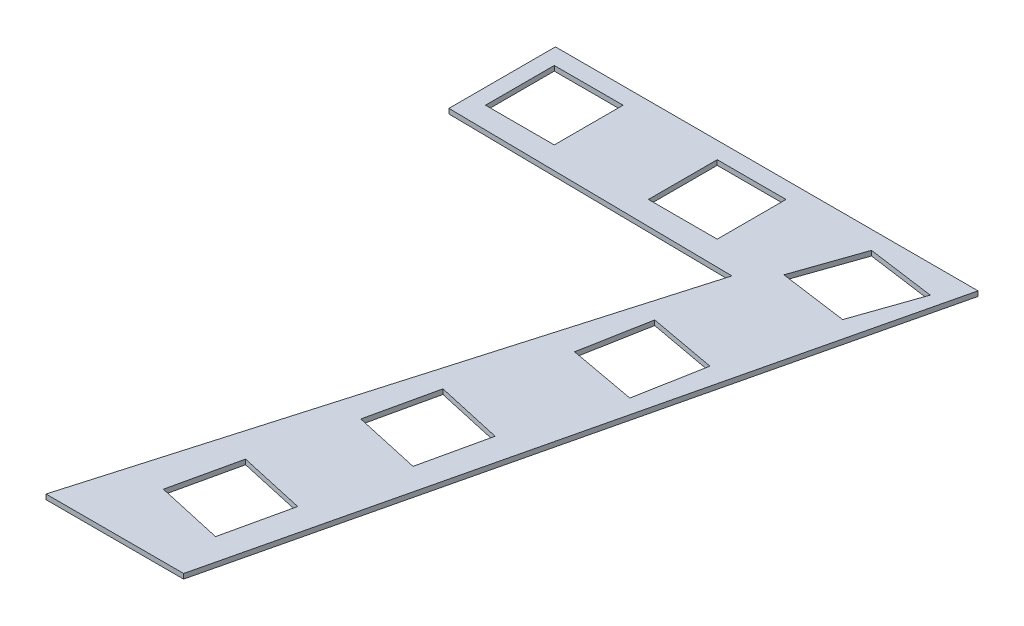
ISO-10303-21;
HEADER;
FILE_DESCRIPTION(('STEP AP214'),'2;1');
FILE_NAME('part.step','',(''),(''),'','','');
FILE_SCHEMA(('AUTOMOTIVE_DESIGN { 1 0 10303 214 1 1 1 1 }'));
ENDSEC;
DATA;
#1=APPLICATION_CONTEXT('core data for automotive mechanical design processes');
#2=APPLICATION_PROTOCOL_DEFINITION('international standard','automotive_design',2000,#1);
#3=PRODUCT_CONTEXT('',#1,'mechanical');
#4=PRODUCT('Part','Part','',(#3));
#5=PRODUCT_RELATED_PRODUCT_CATEGORY('part','',(#4));
#6=PRODUCT_DEFINITION_FORMATION('','',#4);
#7=PRODUCT_DEFINITION_CONTEXT('part definition',#1,'design');
#8=PRODUCT_DEFINITION('design','',#6,#7);
#9=PRODUCT_DEFINITION_SHAPE('','',#8);
#10=(LENGTH_UNIT() NAMED_UNIT(*) SI_UNIT(.MILLI.,.METRE.));
#11=(NAMED_UNIT(*) PLANE_ANGLE_UNIT() SI_UNIT($,.RADIAN.));
#12=(NAMED_UNIT(*) SI_UNIT($,.STERADIAN.) SOLID_ANGLE_UNIT());
#13=UNCERTAINTY_MEASURE_WITH_UNIT(LENGTH_MEASURE(1.E-05),#10,'distance_accuracy_value','');
#14=(GEOMETRIC_REPRESENTATION_CONTEXT(3) GLOBAL_UNCERTAINTY_ASSIGNED_CONTEXT((#13)) GLOBAL_UNIT_ASSIGNED_CONTEXT((#10,
#11,#12)) REPRESENTATION_CONTEXT('',''));
#15=CARTESIAN_POINT('',(0.,0.,0.));
#16=DIRECTION('',(0.,0.,1.));
#17=DIRECTION('',(1.,0.,0.));
#18=AXIS2_PLACEMENT_3D('',#15,#16,#17);
#19=CARTESIAN_POINT('',(0.,1.,0.));
#20=DIRECTION('',(0.,-1.,0.));
#21=DIRECTION('',(0.,0.,-1.));
#22=AXIS2_PLACEMENT_3D('',#19,#20,#21);
#23=PLANE('',#22);
#24=DIRECTION('',(-0.218185590049828,0.,0.975907294928473));
#25=VECTOR('',#24,1.);
#26=CARTESIAN_POINT('',(21.8841294196844,1.,31.5240788048923));
#27=LINE('',#26,#25);
#28=CARTESIAN_POINT('',(24.938727680382,1.,17.8613766758937));
#29=VERTEX_POINT('',#28);
#30=CARTESIAN_POINT('',(21.8841294196844,1.,31.5240788048923));
#31=VERTEX_POINT('',#30);
#32=EDGE_CURVE('E288',#29,#31,#27,.T.);
#33=ORIENTED_EDGE('',*,*,#32,.F.);
#34=DIRECTION('',(-0.975907294928473,0.,-0.218185590049827));
#35=VECTOR('',#34,1.);
#36=CARTESIAN_POINT('',(24.938727680382,1.,17.8613766758937));
#37=LINE('',#36,#35);
#38=CARTESIAN_POINT('',(38.6014298093807,1.,20.9159749365913));
#39=VERTEX_POINT('',#38);
#40=EDGE_CURVE('E57',#39,#29,#37,.T.);
#41=ORIENTED_EDGE('',*,*,#40,.F.);
#42=DIRECTION('',(0.218185590049827,0.,-0.975907294928473));
#43=VECTOR('',#42,1.);
#44=CARTESIAN_POINT('',(38.6014298093807,1.,20.9159749365913));
#45=LINE('',#44,#43);
#46=CARTESIAN_POINT('',(35.5468315486831,1.,34.5786770655899));
#47=VERTEX_POINT('',#46);
#48=EDGE_CURVE('E284',#47,#39,#45,.T.);
#49=ORIENTED_EDGE('',*,*,#48,.F.);
#50=DIRECTION('',(0.975907294928473,0.,0.218185590049827));
#51=VECTOR('',#50,1.);
#52=CARTESIAN_POINT('',(35.5468315486831,1.,34.5786770655899));
#53=LINE('',#52,#51);
#54=EDGE_CURVE('E287',#31,#47,#53,.T.);
#55=ORIENTED_EDGE('',*,*,#54,.F.);
#56=EDGE_LOOP('',(#33,#41,#49,#55));
#57=FACE_BOUND('',#56,.T.);
#58=DIRECTION('',(0.983505594526939,0.,0.180877708781961));
#59=VECTOR('',#58,1.);
#60=CARTESIAN_POINT('',(53.2765468763463,1.,-31.9894990633523));
#61=LINE('',#60,#59);
#62=CARTESIAN_POINT('',(39.5074685529691,1.,-34.5217869862998));
#63=VERTEX_POINT('',#62);
#64=CARTESIAN_POINT('',(53.2765468763463,1.,-31.9894990633523));
#65=VERTEX_POINT('',#64);
#66=EDGE_CURVE('E257',#63,#65,#61,.T.);
#67=ORIENTED_EDGE('',*,*,#66,.F.);
#68=DIRECTION('',(-0.180877708781961,0.,0.983505594526939));
#69=VECTOR('',#68,1.);
#70=CARTESIAN_POINT('',(39.5074685529691,1.,-34.5217869862998));
#71=LINE('',#70,#69);
#72=CARTESIAN_POINT('',(42.0397564759166,1.,-48.2908653096769));
#73=VERTEX_POINT('',#72);
#74=EDGE_CURVE('E61',#73,#63,#71,.T.);
#75=ORIENTED_EDGE('',*,*,#74,.F.);
#76=DIRECTION('',(-0.983505594526939,0.,-0.180877708781961));
#77=VECTOR('',#76,1.);
#78=CARTESIAN_POINT('',(42.0397564759166,1.,-48.2908653096769));
#79=LINE('',#78,#77);
#80=CARTESIAN_POINT('',(55.8088347992937,1.,-45.7585773867294));
#81=VERTEX_POINT('',#80);
#82=EDGE_CURVE('E246',#81,#73,#79,.T.);
#83=ORIENTED_EDGE('',*,*,#82,.F.);
#84=DIRECTION('',(0.180877708781961,0.,-0.983505594526939));
#85=VECTOR('',#84,1.);
#86=CARTESIAN_POINT('',(55.8088347992937,1.,-45.7585773867294));
#87=LINE('',#86,#85);
#88=EDGE_CURVE('E252',#65,#81,#87,.T.);
#89=ORIENTED_EDGE('',*,*,#88,.F.);
#90=EDGE_LOOP('',(#67,#75,#83,#89));
#91=FACE_BOUND('',#90,.T.);
#92=DIRECTION('',(-0.2173379660651,0.,0.976096413530285));
#93=VECTOR('',#92,1.);
#94=CARTESIAN_POINT('',(29.5946176590699,1.,-0.933964765863913));
#95=LINE('',#94,#93);
#96=CARTESIAN_POINT('',(32.6373491839813,1.,-14.5993145552879));
#97=VERTEX_POINT('',#96);
#98=CARTESIAN_POINT('',(29.5946176590699,1.,-0.933964765863913));
#99=VERTEX_POINT('',#98);
#100=EDGE_CURVE('E256',#97,#99,#95,.T.);
#101=ORIENTED_EDGE('',*,*,#100,.F.);
#102=DIRECTION('',(-0.976096413530285,0.,-0.217337966065101));
#103=VECTOR('',#102,1.);
#104=CARTESIAN_POINT('',(32.6373491839813,1.,-14.5993145552879));
#105=LINE('',#104,#103);
#106=CARTESIAN_POINT('',(46.3026989734053,1.,-11.5565830303765));
#107=VERTEX_POINT('',#106);
#108=EDGE_CURVE('E260',#107,#97,#105,.T.);
#109=ORIENTED_EDGE('',*,*,#108,.F.);
#110=DIRECTION('',(0.2173379660651,0.,-0.976096413530285));
#111=VECTOR('',#110,1.);
#112=CARTESIAN_POINT('',(46.3026989734053,1.,-11.5565830303765));
#113=LINE('',#112,#111);
#114=CARTESIAN_POINT('',(43.2599674484939,1.,2.10876675904749));
#115=VERTEX_POINT('',#114);
#116=EDGE_CURVE('E308',#115,#107,#113,.T.);
#117=ORIENTED_EDGE('',*,*,#116,.F.);
#118=DIRECTION('',(0.976096413530285,0.,0.217337966065101));
#119=VECTOR('',#118,1.);
#120=CARTESIAN_POINT('',(43.2599674484939,1.,2.10876675904749));
#121=LINE('',#120,#119);
#122=EDGE_CURVE('E318',#99,#115,#121,.T.);
#123=ORIENTED_EDGE('',*,*,#122,.F.);
#124=EDGE_LOOP('',(#101,#109,#117,#123));
#125=FACE_BOUND('',#124,.T.);
#126=DIRECTION('',(-0.328643627827214,0.,0.944454004114847));
#127=VECTOR('',#126,1.);
#128=CARTESIAN_POINT('',(51.836294231786,1.,-82.6022004857785));
#129=LINE('',#128,#127);
#130=CARTESIAN_POINT('',(51.836294231786,1.,-82.6022004857785));
#131=VERTEX_POINT('',#130);
#132=CARTESIAN_POINT('',(47.235283442205,1.,-69.3798444281706));
#133=VERTEX_POINT('',#132);
#134=EDGE_CURVE('E384',#131,#133,#129,.T.);
#135=ORIENTED_EDGE('',*,*,#134,.F.);
#136=DIRECTION('',(-0.990643802599872,0.,-0.136472914420649));
#137=VECTOR('',#136,1.);
#138=CARTESIAN_POINT('',(65.7053074681842,1.,-80.6915796838894));
#139=LINE('',#138,#137);
#140=CARTESIAN_POINT('',(65.7053074681842,1.,-80.6915796838894));
#141=VERTEX_POINT('',#140);
#142=EDGE_CURVE('E377',#141,#131,#139,.T.);
#143=ORIENTED_EDGE('',*,*,#142,.F.);
#144=DIRECTION('',(0.328643627827215,0.,-0.944454004114847));
#145=VECTOR('',#144,1.);
#146=CARTESIAN_POINT('',(61.1042966786032,1.,-67.4692236262815));
#147=LINE('',#146,#145);
#148=CARTESIAN_POINT('',(61.1042966786032,1.,-67.4692236262815));
#149=VERTEX_POINT('',#148);
#150=EDGE_CURVE('E395',#149,#141,#147,.T.);
#151=ORIENTED_EDGE('',*,*,#150,.F.);
#152=DIRECTION('',(0.990643802599872,0.,0.136472914420649));
#153=VECTOR('',#152,1.);
#154=CARTESIAN_POINT('',(47.235283442205,1.,-69.3798444281706));
#155=LINE('',#154,#153);
#156=EDGE_CURVE('E393',#133,#149,#155,.T.);
#157=ORIENTED_EDGE('',*,*,#156,.F.);
#158=EDGE_LOOP('',(#135,#143,#151,#157));
#159=FACE_BOUND('',#158,.T.);
#160=DIRECTION('',(1.,0.,0.));
#161=VECTOR('',#160,1.);
#162=CARTESIAN_POINT('',(-16.1749388969232,1.,-86.3074722705605));
#163=LINE('',#162,#161);
#164=CARTESIAN_POINT('',(-16.1749388969232,1.,-86.3074722705605));
#165=VERTEX_POINT('',#164);
#166=CARTESIAN_POINT('',(69.8050611030768,1.,-86.3074722705605));
#167=VERTEX_POINT('',#166);
#168=EDGE_CURVE('E430',#165,#167,#163,.T.);
#169=ORIENTED_EDGE('',*,*,#168,.F.);
#170=DIRECTION('',(0.,0.,1.));
#171=VECTOR('',#170,1.);
#172=CARTESIAN_POINT('',(-16.1749388969232,1.,-86.3074722705605));
#173=LINE('',#172,#171);
#174=CARTESIAN_POINT('',(-16.1749388969232,1.,-64.6374722705605));
#175=VERTEX_POINT('',#174);
#176=EDGE_CURVE('E442',#165,#175,#173,.T.);
#177=ORIENTED_EDGE('',*,*,#176,.T.);
#178=DIRECTION('',(-0.999919679429035,0.,-0.0126741741559428));
#179=VECTOR('',#178,1.);
#180=CARTESIAN_POINT('',(42.1450611030768,1.,-63.8982550594374));
#181=LINE('',#180,#179);
#182=CARTESIAN_POINT('',(42.1450611030768,1.,-63.8982550594374));
#183=VERTEX_POINT('',#182);
#184=EDGE_CURVE('E439',#183,#175,#181,.T.);
#185=ORIENTED_EDGE('',*,*,#184,.F.);
#186=DIRECTION('',(0.278266644133147,0.,-0.960503865043175));
#187=VECTOR('',#186,1.);
#188=CARTESIAN_POINT('',(10.7927583085952,1.,44.321715414977));
#189=LINE('',#188,#187);
#190=CARTESIAN_POINT('',(10.7927583085952,1.,44.321715414977));
#191=VERTEX_POINT('',#190);
#192=EDGE_CURVE('E440',#191,#183,#189,.T.);
#193=ORIENTED_EDGE('',*,*,#192,.F.);
#194=DIRECTION('',(-1.,0.,0.));
#195=VECTOR('',#194,1.);
#196=CARTESIAN_POINT('',(38.7927583085952,1.,44.321715414977));
#197=LINE('',#196,#195);
#198=CARTESIAN_POINT('',(38.7927583085952,1.,44.321715414977));
#199=VERTEX_POINT('',#198);
#200=EDGE_CURVE('E432',#199,#191,#197,.T.);
#201=ORIENTED_EDGE('',*,*,#200,.F.);
#202=DIRECTION('',(-0.230986911920763,0.,0.972956857482031));
#203=VECTOR('',#202,1.);
#204=CARTESIAN_POINT('',(69.8050611030768,1.,-86.3074722705605));
#205=LINE('',#204,#203);
#206=EDGE_CURVE('E427',#167,#199,#205,.T.);
#207=ORIENTED_EDGE('',*,*,#206,.F.);
#208=EDGE_LOOP('',(#169,#177,#185,#193,#201,#207));
#209=FACE_BOUND('',#208,.T.);
#210=DIRECTION('',(-1.,0.,0.));
#211=VECTOR('',#210,1.);
#212=CARTESIAN_POINT('',(34.1686780579879,1.,-82.8803558478966));
#213=LINE('',#212,#211);
#214=CARTESIAN_POINT('',(34.1686780579879,1.,-82.8803558478966));
#215=VERTEX_POINT('',#214);
#216=CARTESIAN_POINT('',(20.1686780579879,1.,-82.8803558478966));
#217=VERTEX_POINT('',#216);
#218=EDGE_CURVE('E415',#215,#217,#213,.T.);
#219=ORIENTED_EDGE('',*,*,#218,.F.);
#220=DIRECTION('',(0.,0.,-1.));
#221=VECTOR('',#220,1.);
#222=CARTESIAN_POINT('',(34.1686780579879,1.,-68.8803558478966));
#223=LINE('',#222,#221);
#224=CARTESIAN_POINT('',(34.1686780579879,1.,-68.8803558478966));
#225=VERTEX_POINT('',#224);
#226=EDGE_CURVE('E410',#225,#215,#223,.T.);
#227=ORIENTED_EDGE('',*,*,#226,.F.);
#228=DIRECTION('',(1.,0.,0.));
#229=VECTOR('',#228,1.);
#230=CARTESIAN_POINT('',(20.1686780579879,1.,-68.8803558478966));
#231=LINE('',#230,#229);
#232=CARTESIAN_POINT('',(20.1686780579879,1.,-68.8803558478966));
#233=VERTEX_POINT('',#232);
#234=EDGE_CURVE('E423',#233,#225,#231,.T.);
#235=ORIENTED_EDGE('',*,*,#234,.F.);
#236=DIRECTION('',(0.,0.,1.));
#237=VECTOR('',#236,1.);
#238=CARTESIAN_POINT('',(20.1686780579879,1.,-82.8803558478966));
#239=LINE('',#238,#237);
#240=EDGE_CURVE('E425',#217,#233,#239,.T.);
#241=ORIENTED_EDGE('',*,*,#240,.F.);
#242=EDGE_LOOP('',(#219,#227,#235,#241));
#243=FACE_BOUND('',#242,.T.);
#244=DIRECTION('',(-1.,0.,0.));
#245=VECTOR('',#244,1.);
#246=CARTESIAN_POINT('',(0.985761703369159,1.,-82.907608587731));
#247=LINE('',#246,#245);
#248=CARTESIAN_POINT('',(0.985761703369159,1.,-82.907608587731));
#249=VERTEX_POINT('',#248);
#250=CARTESIAN_POINT('',(-13.0142382966308,1.,-82.907608587731));
#251=VERTEX_POINT('',#250);
#252=EDGE_CURVE('E331',#249,#251,#247,.T.);
#253=ORIENTED_EDGE('',*,*,#252,.F.);
#254=DIRECTION('',(0.,0.,-1.));
#255=VECTOR('',#254,1.);
#256=CARTESIAN_POINT('',(0.98576170336916,1.,-68.907608587731));
#257=LINE('',#256,#255);
#258=CARTESIAN_POINT('',(0.98576170336916,1.,-68.907608587731));
#259=VERTEX_POINT('',#258);
#260=EDGE_CURVE('E345',#259,#249,#257,.T.);
#261=ORIENTED_EDGE('',*,*,#260,.F.);
#262=DIRECTION('',(1.,0.,0.));
#263=VECTOR('',#262,1.);
#264=CARTESIAN_POINT('',(-13.0142382966308,1.,-68.907608587731));
#265=LINE('',#264,#263);
#266=CARTESIAN_POINT('',(-13.0142382966308,1.,-68.907608587731));
#267=VERTEX_POINT('',#266);
#268=EDGE_CURVE('E339',#267,#259,#265,.T.);
#269=ORIENTED_EDGE('',*,*,#268,.F.);
#270=DIRECTION('',(0.,0.,1.));
#271=VECTOR('',#270,1.);
#272=CARTESIAN_POINT('',(-13.0142382966308,1.,-82.907608587731));
#273=LINE('',#272,#271);
#274=EDGE_CURVE('E337',#251,#267,#273,.T.);
#275=ORIENTED_EDGE('',*,*,#274,.F.);
#276=EDGE_LOOP('',(#253,#261,#269,#275));
#277=FACE_BOUND('',#276,.T.);
#278=ADVANCED_FACE('F39',(#57,#91,#125,#159,#209,#243,#277),#23,.F.);
#279=CARTESIAN_POINT('',(0.,0.,0.));
#280=DIRECTION('',(0.,-1.,0.));
#281=DIRECTION('',(0.,0.,-1.));
#282=AXIS2_PLACEMENT_3D('',#279,#280,#281);
#283=PLANE('',#282);
#284=DIRECTION('',(-0.975907294928473,0.,-0.218185590049827));
#285=VECTOR('',#284,1.);
#286=CARTESIAN_POINT('',(24.938727680382,0.,17.8613766758937));
#287=LINE('',#286,#285);
#288=CARTESIAN_POINT('',(38.6014298093807,0.,20.9159749365913));
#289=VERTEX_POINT('',#288);
#290=CARTESIAN_POINT('',(24.938727680382,0.,17.8613766758937));
#291=VERTEX_POINT('',#290);
#292=EDGE_CURVE('E289',#289,#291,#287,.T.);
#293=ORIENTED_EDGE('',*,*,#292,.T.);
#294=DIRECTION('',(-0.218185590049828,0.,0.975907294928473));
#295=VECTOR('',#294,1.);
#296=CARTESIAN_POINT('',(21.8841294196844,0.,31.5240788048923));
#297=LINE('',#296,#295);
#298=CARTESIAN_POINT('',(21.8841294196844,0.,31.5240788048923));
#299=VERTEX_POINT('',#298);
#300=EDGE_CURVE('E299',#291,#299,#297,.T.);
#301=ORIENTED_EDGE('',*,*,#300,.T.);
#302=DIRECTION('',(0.975907294928473,0.,0.218185590049827));
#303=VECTOR('',#302,1.);
#304=CARTESIAN_POINT('',(35.5468315486831,0.,34.5786770655899));
#305=LINE('',#304,#303);
#306=CARTESIAN_POINT('',(35.5468315486831,0.,34.5786770655899));
#307=VERTEX_POINT('',#306);
#308=EDGE_CURVE('E298',#299,#307,#305,.T.);
#309=ORIENTED_EDGE('',*,*,#308,.T.);
#310=DIRECTION('',(0.218185590049827,0.,-0.975907294928473));
#311=VECTOR('',#310,1.);
#312=CARTESIAN_POINT('',(38.6014298093807,0.,20.9159749365913));
#313=LINE('',#312,#311);
#314=EDGE_CURVE('E277',#307,#289,#313,.T.);
#315=ORIENTED_EDGE('',*,*,#314,.T.);
#316=EDGE_LOOP('',(#293,#301,#309,#315));
#317=FACE_BOUND('',#316,.T.);
#318=DIRECTION('',(-0.180877708781961,0.,0.983505594526939));
#319=VECTOR('',#318,1.);
#320=CARTESIAN_POINT('',(39.5074685529691,0.,-34.5217869862998));
#321=LINE('',#320,#319);
#322=CARTESIAN_POINT('',(42.0397564759166,0.,-48.2908653096769));
#323=VERTEX_POINT('',#322);
#324=CARTESIAN_POINT('',(39.5074685529691,0.,-34.5217869862998));
#325=VERTEX_POINT('',#324);
#326=EDGE_CURVE('E237',#323,#325,#321,.T.);
#327=ORIENTED_EDGE('',*,*,#326,.T.);
#328=DIRECTION('',(0.983505594526939,0.,0.180877708781961));
#329=VECTOR('',#328,1.);
#330=CARTESIAN_POINT('',(53.2765468763463,0.,-31.9894990633523));
#331=LINE('',#330,#329);
#332=CARTESIAN_POINT('',(53.2765468763463,0.,-31.9894990633523));
#333=VERTEX_POINT('',#332);
#334=EDGE_CURVE('E268',#325,#333,#331,.T.);
#335=ORIENTED_EDGE('',*,*,#334,.T.);
#336=DIRECTION('',(0.180877708781961,0.,-0.983505594526939));
#337=VECTOR('',#336,1.);
#338=CARTESIAN_POINT('',(55.8088347992937,0.,-45.7585773867294));
#339=LINE('',#338,#337);
#340=CARTESIAN_POINT('',(55.8088347992937,0.,-45.7585773867294));
#341=VERTEX_POINT('',#340);
#342=EDGE_CURVE('E267',#333,#341,#339,.T.);
#343=ORIENTED_EDGE('',*,*,#342,.T.);
#344=DIRECTION('',(-0.983505594526939,0.,-0.180877708781961));
#345=VECTOR('',#344,1.);
#346=CARTESIAN_POINT('',(42.0397564759166,0.,-48.2908653096769));
#347=LINE('',#346,#345);
#348=EDGE_CURVE('E261',#341,#323,#347,.T.);
#349=ORIENTED_EDGE('',*,*,#348,.T.);
#350=EDGE_LOOP('',(#327,#335,#343,#349));
#351=FACE_BOUND('',#350,.T.);
#352=DIRECTION('',(-0.976096413530285,0.,-0.217337966065101));
#353=VECTOR('',#352,1.);
#354=CARTESIAN_POINT('',(32.6373491839813,0.,-14.5993145552879));
#355=LINE('',#354,#353);
#356=CARTESIAN_POINT('',(46.3026989734053,0.,-11.5565830303765));
#357=VERTEX_POINT('',#356);
#358=CARTESIAN_POINT('',(32.6373491839813,0.,-14.5993145552879));
#359=VERTEX_POINT('',#358);
#360=EDGE_CURVE('E302',#357,#359,#355,.T.);
#361=ORIENTED_EDGE('',*,*,#360,.T.);
#362=DIRECTION('',(-0.2173379660651,0.,0.976096413530285));
#363=VECTOR('',#362,1.);
#364=CARTESIAN_POINT('',(29.5946176590699,0.,-0.933964765863913));
#365=LINE('',#364,#363);
#366=CARTESIAN_POINT('',(29.5946176590699,0.,-0.933964765863913));
#367=VERTEX_POINT('',#366);
#368=EDGE_CURVE('E310',#359,#367,#365,.T.);
#369=ORIENTED_EDGE('',*,*,#368,.T.);
#370=DIRECTION('',(0.976096413530285,0.,0.217337966065101));
#371=VECTOR('',#370,1.);
#372=CARTESIAN_POINT('',(43.2599674484939,0.,2.10876675904749));
#373=LINE('',#372,#371);
#374=CARTESIAN_POINT('',(43.2599674484939,0.,2.10876675904749));
#375=VERTEX_POINT('',#374);
#376=EDGE_CURVE('E311',#367,#375,#373,.T.);
#377=ORIENTED_EDGE('',*,*,#376,.T.);
#378=DIRECTION('',(0.2173379660651,0.,-0.976096413530285));
#379=VECTOR('',#378,1.);
#380=CARTESIAN_POINT('',(46.3026989734053,0.,-11.5565830303765));
#381=LINE('',#380,#379);
#382=EDGE_CURVE('E313',#375,#357,#381,.T.);
#383=ORIENTED_EDGE('',*,*,#382,.T.);
#384=EDGE_LOOP('',(#361,#369,#377,#383));
#385=FACE_BOUND('',#384,.T.);
#386=DIRECTION('',(1.,0.,0.));
#387=VECTOR('',#386,1.);
#388=CARTESIAN_POINT('',(-16.1749388969232,0.,-86.3074722705605));
#389=LINE('',#388,#387);
#390=CARTESIAN_POINT('',(-16.1749388969232,0.,-86.3074722705605));
#391=VERTEX_POINT('',#390);
#392=CARTESIAN_POINT('',(69.8050611030768,0.,-86.3074722705605));
#393=VERTEX_POINT('',#392);
#394=EDGE_CURVE('E366',#391,#393,#389,.T.);
#395=ORIENTED_EDGE('',*,*,#394,.T.);
#396=DIRECTION('',(-0.230986911920763,0.,0.972956857482031));
#397=VECTOR('',#396,1.);
#398=CARTESIAN_POINT('',(69.8050611030768,0.,-86.3074722705605));
#399=LINE('',#398,#397);
#400=CARTESIAN_POINT('',(38.7927583085952,0.,44.321715414977));
#401=VERTEX_POINT('',#400);
#402=EDGE_CURVE('E450',#393,#401,#399,.T.);
#403=ORIENTED_EDGE('',*,*,#402,.T.);
#404=DIRECTION('',(-1.,0.,0.));
#405=VECTOR('',#404,1.);
#406=CARTESIAN_POINT('',(38.7927583085952,0.,44.321715414977));
#407=LINE('',#406,#405);
#408=CARTESIAN_POINT('',(10.7927583085952,0.,44.321715414977));
#409=VERTEX_POINT('',#408);
#410=EDGE_CURVE('E448',#401,#409,#407,.T.);
#411=ORIENTED_EDGE('',*,*,#410,.T.);
#412=DIRECTION('',(0.278266644133147,0.,-0.960503865043175));
#413=VECTOR('',#412,1.);
#414=CARTESIAN_POINT('',(10.7927583085952,0.,44.321715414977));
#415=LINE('',#414,#413);
#416=CARTESIAN_POINT('',(42.1450611030768,0.,-63.8982550594374));
#417=VERTEX_POINT('',#416);
#418=EDGE_CURVE('E454',#409,#417,#415,.T.);
#419=ORIENTED_EDGE('',*,*,#418,.T.);
#420=DIRECTION('',(-0.999919679429035,0.,-0.0126741741559428));
#421=VECTOR('',#420,1.);
#422=CARTESIAN_POINT('',(42.1450611030768,0.,-63.8982550594374));
#423=LINE('',#422,#421);
#424=CARTESIAN_POINT('',(-16.1749388969232,0.,-64.6374722705605));
#425=VERTEX_POINT('',#424);
#426=EDGE_CURVE('E457',#417,#425,#423,.T.);
#427=ORIENTED_EDGE('',*,*,#426,.T.);
#428=DIRECTION('',(0.,0.,1.));
#429=VECTOR('',#428,1.);
#430=CARTESIAN_POINT('',(-16.1749388969232,0.,-86.3074722705605));
#431=LINE('',#430,#429);
#432=EDGE_CURVE('E431',#391,#425,#431,.T.);
#433=ORIENTED_EDGE('',*,*,#432,.F.);
#434=EDGE_LOOP('',(#395,#403,#411,#419,#427,#433));
#435=FACE_BOUND('',#434,.T.);
#436=DIRECTION('',(0.,0.,-1.));
#437=VECTOR('',#436,1.);
#438=CARTESIAN_POINT('',(34.1686780579879,0.,-68.8803558478966));
#439=LINE('',#438,#437);
#440=CARTESIAN_POINT('',(34.1686780579879,0.,-68.8803558478966));
#441=VERTEX_POINT('',#440);
#442=CARTESIAN_POINT('',(34.1686780579879,0.,-82.8803558478966));
#443=VERTEX_POINT('',#442);
#444=EDGE_CURVE('E409',#441,#443,#439,.T.);
#445=ORIENTED_EDGE('',*,*,#444,.T.);
#446=DIRECTION('',(-1.,0.,0.));
#447=VECTOR('',#446,1.);
#448=CARTESIAN_POINT('',(34.1686780579879,0.,-82.8803558478966));
#449=LINE('',#448,#447);
#450=CARTESIAN_POINT('',(20.1686780579879,0.,-82.8803558478966));
#451=VERTEX_POINT('',#450);
#452=EDGE_CURVE('E371',#443,#451,#449,.T.);
#453=ORIENTED_EDGE('',*,*,#452,.T.);
#454=DIRECTION('',(0.,0.,1.));
#455=VECTOR('',#454,1.);
#456=CARTESIAN_POINT('',(20.1686780579879,0.,-82.8803558478966));
#457=LINE('',#456,#455);
#458=CARTESIAN_POINT('',(20.1686780579879,0.,-68.8803558478966));
#459=VERTEX_POINT('',#458);
#460=EDGE_CURVE('E413',#451,#459,#457,.T.);
#461=ORIENTED_EDGE('',*,*,#460,.T.);
#462=DIRECTION('',(1.,0.,0.));
#463=VECTOR('',#462,1.);
#464=CARTESIAN_POINT('',(20.1686780579879,0.,-68.8803558478966));
#465=LINE('',#464,#463);
#466=EDGE_CURVE('E412',#459,#441,#465,.T.);
#467=ORIENTED_EDGE('',*,*,#466,.T.);
#468=EDGE_LOOP('',(#445,#453,#461,#467));
#469=FACE_BOUND('',#468,.T.);
#470=DIRECTION('',(-0.990643802599872,0.,-0.136472914420649));
#471=VECTOR('',#470,1.);
#472=CARTESIAN_POINT('',(65.7053074681842,0.,-80.6915796838894));
#473=LINE('',#472,#471);
#474=CARTESIAN_POINT('',(65.7053074681842,0.,-80.6915796838894));
#475=VERTEX_POINT('',#474);
#476=CARTESIAN_POINT('',(51.836294231786,0.,-82.6022004857785));
#477=VERTEX_POINT('',#476);
#478=EDGE_CURVE('E378',#475,#477,#473,.T.);
#479=ORIENTED_EDGE('',*,*,#478,.T.);
#480=DIRECTION('',(-0.328643627827214,0.,0.944454004114847));
#481=VECTOR('',#480,1.);
#482=CARTESIAN_POINT('',(51.836294231786,0.,-82.6022004857785));
#483=LINE('',#482,#481);
#484=CARTESIAN_POINT('',(47.235283442205,0.,-69.3798444281706));
#485=VERTEX_POINT('',#484);
#486=EDGE_CURVE('E346',#477,#485,#483,.T.);
#487=ORIENTED_EDGE('',*,*,#486,.T.);
#488=DIRECTION('',(0.990643802599872,0.,0.136472914420649));
#489=VECTOR('',#488,1.);
#490=CARTESIAN_POINT('',(47.235283442205,0.,-69.3798444281706));
#491=LINE('',#490,#489);
#492=CARTESIAN_POINT('',(61.1042966786032,0.,-67.4692236262815));
#493=VERTEX_POINT('',#492);
#494=EDGE_CURVE('E387',#485,#493,#491,.T.);
#495=ORIENTED_EDGE('',*,*,#494,.T.);
#496=DIRECTION('',(0.328643627827215,0.,-0.944454004114847));
#497=VECTOR('',#496,1.);
#498=CARTESIAN_POINT('',(61.1042966786032,0.,-67.4692236262815));
#499=LINE('',#498,#497);
#500=EDGE_CURVE('E385',#493,#475,#499,.T.);
#501=ORIENTED_EDGE('',*,*,#500,.T.);
#502=EDGE_LOOP('',(#479,#487,#495,#501));
#503=FACE_BOUND('',#502,.T.);
#504=DIRECTION('',(0.,0.,-1.));
#505=VECTOR('',#504,1.);
#506=CARTESIAN_POINT('',(0.98576170336916,0.,-68.907608587731));
#507=LINE('',#506,#505);
#508=CARTESIAN_POINT('',(0.98576170336916,0.,-68.907608587731));
#509=VERTEX_POINT('',#508);
#510=CARTESIAN_POINT('',(0.985761703369159,0.,-82.907608587731));
#511=VERTEX_POINT('',#510);
#512=EDGE_CURVE('E340',#509,#511,#507,.T.);
#513=ORIENTED_EDGE('',*,*,#512,.T.);
#514=DIRECTION('',(-1.,0.,0.));
#515=VECTOR('',#514,1.);
#516=CARTESIAN_POINT('',(0.985761703369159,0.,-82.907608587731));
#517=LINE('',#516,#515);
#518=CARTESIAN_POINT('',(-13.0142382966308,0.,-82.907608587731));
#519=VERTEX_POINT('',#518);
#520=EDGE_CURVE('E343',#511,#519,#517,.T.);
#521=ORIENTED_EDGE('',*,*,#520,.T.);
#522=DIRECTION('',(0.,0.,1.));
#523=VECTOR('',#522,1.);
#524=CARTESIAN_POINT('',(-13.0142382966308,0.,-82.907608587731));
#525=LINE('',#524,#523);
#526=CARTESIAN_POINT('',(-13.0142382966308,0.,-68.907608587731));
#527=VERTEX_POINT('',#526);
#528=EDGE_CURVE('E349',#519,#527,#525,.T.);
#529=ORIENTED_EDGE('',*,*,#528,.T.);
#530=DIRECTION('',(1.,0.,0.));
#531=VECTOR('',#530,1.);
#532=CARTESIAN_POINT('',(-13.0142382966308,0.,-68.907608587731));
#533=LINE('',#532,#531);
#534=EDGE_CURVE('E354',#527,#509,#533,.T.);
#535=ORIENTED_EDGE('',*,*,#534,.T.);
#536=EDGE_LOOP('',(#513,#521,#529,#535));
#537=FACE_BOUND('',#536,.T.);
#538=ADVANCED_FACE('F477',(#317,#351,#385,#435,#469,#503,#537),#283,.T.);
#539=CARTESIAN_POINT('',(-16.1749388969232,1.,-86.3074722705605));
#540=DIRECTION('',(0.,0.,-1.));
#541=DIRECTION('',(-1.,0.,0.));
#542=AXIS2_PLACEMENT_3D('',#539,#540,#541);
#543=PLANE('',#542);
#544=ORIENTED_EDGE('',*,*,#394,.F.);
#545=DIRECTION('',(0.,-1.,0.));
#546=VECTOR('',#545,1.);
#547=CARTESIAN_POINT('',(-16.1749388969232,1.,-86.3074722705605));
#548=LINE('',#547,#546);
#549=EDGE_CURVE('E11',#165,#391,#548,.T.);
#550=ORIENTED_EDGE('',*,*,#549,.F.);
#551=ORIENTED_EDGE('',*,*,#168,.T.);
#552=DIRECTION('',(0.,-1.,0.));
#553=VECTOR('',#552,1.);
#554=CARTESIAN_POINT('',(69.8050611030768,1.,-86.3074722705605));
#555=LINE('',#554,#553);
#556=EDGE_CURVE('E43',#167,#393,#555,.T.);
#557=ORIENTED_EDGE('',*,*,#556,.T.);
#558=EDGE_LOOP('',(#544,#550,#551,#557));
#559=FACE_BOUND('',#558,.T.);
#560=ADVANCED_FACE('F41',(#559),#543,.T.);
#561=CARTESIAN_POINT('',(-16.1749388969232,1.,-86.3074722705605));
#562=DIRECTION('',(1.,0.,0.));
#563=DIRECTION('',(0.,0.,-1.));
#564=AXIS2_PLACEMENT_3D('',#561,#562,#563);
#565=PLANE('',#564);
#566=ORIENTED_EDGE('',*,*,#432,.T.);
#567=DIRECTION('',(0.,-1.,0.));
#568=VECTOR('',#567,1.);
#569=CARTESIAN_POINT('',(-16.1749388969232,1.,-64.6374722705605));
#570=LINE('',#569,#568);
#571=EDGE_CURVE('E48',#175,#425,#570,.T.);
#572=ORIENTED_EDGE('',*,*,#571,.F.);
#573=ORIENTED_EDGE('',*,*,#176,.F.);
#574=ORIENTED_EDGE('',*,*,#549,.T.);
#575=EDGE_LOOP('',(#566,#572,#573,#574));
#576=FACE_BOUND('',#575,.T.);
#577=ADVANCED_FACE('F482',(#576),#565,.F.);
#578=CARTESIAN_POINT('',(42.1450611030768,1.,-63.8982550594374));
#579=DIRECTION('',(-0.0126741741559428,0.,0.999919679429036));
#580=DIRECTION('',(0.999919679429035,0.,0.0126741741559428));
#581=AXIS2_PLACEMENT_3D('',#578,#579,#580);
#582=PLANE('',#581);
#583=ORIENTED_EDGE('',*,*,#426,.F.);
#584=DIRECTION('',(0.,-1.,0.));
#585=VECTOR('',#584,1.);
#586=CARTESIAN_POINT('',(42.1450611030768,1.,-63.8982550594374));
#587=LINE('',#586,#585);
#588=EDGE_CURVE('E464',#183,#417,#587,.T.);
#589=ORIENTED_EDGE('',*,*,#588,.F.);
#590=ORIENTED_EDGE('',*,*,#184,.T.);
#591=ORIENTED_EDGE('',*,*,#571,.T.);
#592=EDGE_LOOP('',(#583,#589,#590,#591));
#593=FACE_BOUND('',#592,.T.);
#594=ADVANCED_FACE('F494',(#593),#582,.T.);
#595=CARTESIAN_POINT('',(10.7927583085952,1.,44.321715414977));
#596=DIRECTION('',(-0.960503865043175,0.,-0.278266644133147));
#597=DIRECTION('',(-0.278266644133147,0.,0.960503865043175));
#598=AXIS2_PLACEMENT_3D('',#595,#596,#597);
#599=PLANE('',#598);
#600=ORIENTED_EDGE('',*,*,#418,.F.);
#601=DIRECTION('',(0.,-1.,0.));
#602=VECTOR('',#601,1.);
#603=CARTESIAN_POINT('',(10.7927583085952,1.,44.321715414977));
#604=LINE('',#603,#602);
#605=EDGE_CURVE('E461',#191,#409,#604,.T.);
#606=ORIENTED_EDGE('',*,*,#605,.F.);
#607=ORIENTED_EDGE('',*,*,#192,.T.);
#608=ORIENTED_EDGE('',*,*,#588,.T.);
#609=EDGE_LOOP('',(#600,#606,#607,#608));
#610=FACE_BOUND('',#609,.T.);
#611=ADVANCED_FACE('F495',(#610),#599,.T.);
#612=CARTESIAN_POINT('',(38.7927583085952,1.,44.321715414977));
#613=DIRECTION('',(0.,0.,1.));
#614=DIRECTION('',(1.,0.,0.));
#615=AXIS2_PLACEMENT_3D('',#612,#613,#614);
#616=PLANE('',#615);
#617=ORIENTED_EDGE('',*,*,#410,.F.);
#618=DIRECTION('',(0.,-1.,0.));
#619=VECTOR('',#618,1.);
#620=CARTESIAN_POINT('',(38.7927583085952,1.,44.321715414977));
#621=LINE('',#620,#619);
#622=EDGE_CURVE('E463',#199,#401,#621,.T.);
#623=ORIENTED_EDGE('',*,*,#622,.F.);
#624=ORIENTED_EDGE('',*,*,#200,.T.);
#625=ORIENTED_EDGE('',*,*,#605,.T.);
#626=EDGE_LOOP('',(#617,#623,#624,#625));
#627=FACE_BOUND('',#626,.T.);
#628=ADVANCED_FACE('F490',(#627),#616,.T.);
#629=CARTESIAN_POINT('',(69.8050611030768,1.,-86.3074722705605));
#630=DIRECTION('',(0.972956857482031,0.,0.230986911920763));
#631=DIRECTION('',(0.230986911920763,0.,-0.972956857482031));
#632=AXIS2_PLACEMENT_3D('',#629,#630,#631);
#633=PLANE('',#632);
#634=ORIENTED_EDGE('',*,*,#402,.F.);
#635=ORIENTED_EDGE('',*,*,#556,.F.);
#636=ORIENTED_EDGE('',*,*,#206,.T.);
#637=ORIENTED_EDGE('',*,*,#622,.T.);
#638=EDGE_LOOP('',(#634,#635,#636,#637));
#639=FACE_BOUND('',#638,.T.);
#640=ADVANCED_FACE('F474',(#639),#633,.T.);
#641=CARTESIAN_POINT('',(34.1686780579879,1.,-82.8803558478966));
#642=DIRECTION('',(0.,0.,1.));
#643=DIRECTION('',(1.,0.,0.));
#644=AXIS2_PLACEMENT_3D('',#641,#642,#643);
#645=PLANE('',#644);
#646=ORIENTED_EDGE('',*,*,#452,.F.);
#647=DIRECTION('',(0.,-1.,0.));
#648=VECTOR('',#647,1.);
#649=CARTESIAN_POINT('',(34.1686780579879,1.,-82.8803558478966));
#650=LINE('',#649,#648);
#651=EDGE_CURVE('E404',#215,#443,#650,.T.);
#652=ORIENTED_EDGE('',*,*,#651,.F.);
#653=ORIENTED_EDGE('',*,*,#218,.T.);
#654=DIRECTION('',(0.,-1.,0.));
#655=VECTOR('',#654,1.);
#656=CARTESIAN_POINT('',(20.1686780579879,1.,-82.8803558478966));
#657=LINE('',#656,#655);
#658=EDGE_CURVE('E330',#217,#451,#657,.T.);
#659=ORIENTED_EDGE('',*,*,#658,.T.);
#660=EDGE_LOOP('',(#646,#652,#653,#659));
#661=FACE_BOUND('',#660,.T.);
#662=ADVANCED_FACE('F527',(#661),#645,.T.);
#663=CARTESIAN_POINT('',(20.1686780579879,1.,-82.8803558478966));
#664=DIRECTION('',(1.,0.,0.));
#665=DIRECTION('',(0.,0.,-1.));
#666=AXIS2_PLACEMENT_3D('',#663,#664,#665);
#667=PLANE('',#666);
#668=ORIENTED_EDGE('',*,*,#460,.F.);
#669=ORIENTED_EDGE('',*,*,#658,.F.);
#670=ORIENTED_EDGE('',*,*,#240,.T.);
#671=DIRECTION('',(0.,-1.,0.));
#672=VECTOR('',#671,1.);
#673=CARTESIAN_POINT('',(20.1686780579879,1.,-68.8803558478966));
#674=LINE('',#673,#672);
#675=EDGE_CURVE('E398',#233,#459,#674,.T.);
#676=ORIENTED_EDGE('',*,*,#675,.T.);
#677=EDGE_LOOP('',(#668,#669,#670,#676));
#678=FACE_BOUND('',#677,.T.);
#679=ADVANCED_FACE('F525',(#678),#667,.T.);
#680=CARTESIAN_POINT('',(20.1686780579879,1.,-68.8803558478966));
#681=DIRECTION('',(0.,0.,-1.));
#682=DIRECTION('',(-1.,0.,0.));
#683=AXIS2_PLACEMENT_3D('',#680,#681,#682);
#684=PLANE('',#683);
#685=ORIENTED_EDGE('',*,*,#466,.F.);
#686=ORIENTED_EDGE('',*,*,#675,.F.);
#687=ORIENTED_EDGE('',*,*,#234,.T.);
#688=DIRECTION('',(0.,-1.,0.));
#689=VECTOR('',#688,1.);
#690=CARTESIAN_POINT('',(34.1686780579879,1.,-68.8803558478966));
#691=LINE('',#690,#689);
#692=EDGE_CURVE('E405',#225,#441,#691,.T.);
#693=ORIENTED_EDGE('',*,*,#692,.T.);
#694=EDGE_LOOP('',(#685,#686,#687,#693));
#695=FACE_BOUND('',#694,.T.);
#696=ADVANCED_FACE('F519',(#695),#684,.T.);
#697=CARTESIAN_POINT('',(34.1686780579879,1.,-68.8803558478966));
#698=DIRECTION('',(-1.,0.,0.));
#699=DIRECTION('',(0.,0.,1.));
#700=AXIS2_PLACEMENT_3D('',#697,#698,#699);
#701=PLANE('',#700);
#702=ORIENTED_EDGE('',*,*,#444,.F.);
#703=ORIENTED_EDGE('',*,*,#692,.F.);
#704=ORIENTED_EDGE('',*,*,#226,.T.);
#705=ORIENTED_EDGE('',*,*,#651,.T.);
#706=EDGE_LOOP('',(#702,#703,#704,#705));
#707=FACE_BOUND('',#706,.T.);
#708=ADVANCED_FACE('F511',(#707),#701,.T.);
#709=CARTESIAN_POINT('',(51.836294231786,1.,-82.6022004857785));
#710=DIRECTION('',(0.944454004114847,0.,0.328643627827214));
#711=DIRECTION('',(0.328643627827214,0.,-0.944454004114847));
#712=AXIS2_PLACEMENT_3D('',#709,#710,#711);
#713=PLANE('',#712);
#714=ORIENTED_EDGE('',*,*,#486,.F.);
#715=DIRECTION('',(0.,-1.,0.));
#716=VECTOR('',#715,1.);
#717=CARTESIAN_POINT('',(51.836294231786,1.,-82.6022004857785));
#718=LINE('',#717,#716);
#719=EDGE_CURVE('E374',#131,#477,#718,.T.);
#720=ORIENTED_EDGE('',*,*,#719,.F.);
#721=ORIENTED_EDGE('',*,*,#134,.T.);
#722=DIRECTION('',(0.,-1.,0.));
#723=VECTOR('',#722,1.);
#724=CARTESIAN_POINT('',(47.235283442205,1.,-69.3798444281706));
#725=LINE('',#724,#723);
#726=EDGE_CURVE('E370',#133,#485,#725,.T.);
#727=ORIENTED_EDGE('',*,*,#726,.T.);
#728=EDGE_LOOP('',(#714,#720,#721,#727));
#729=FACE_BOUND('',#728,.T.);
#730=ADVANCED_FACE('F520',(#729),#713,.T.);
#731=CARTESIAN_POINT('',(47.235283442205,1.,-69.3798444281706));
#732=DIRECTION('',(0.136472914420649,0.,-0.990643802599872));
#733=DIRECTION('',(-0.990643802599872,0.,-0.136472914420649));
#734=AXIS2_PLACEMENT_3D('',#731,#732,#733);
#735=PLANE('',#734);
#736=ORIENTED_EDGE('',*,*,#494,.F.);
#737=ORIENTED_EDGE('',*,*,#726,.F.);
#738=ORIENTED_EDGE('',*,*,#156,.T.);
#739=DIRECTION('',(0.,-1.,0.));
#740=VECTOR('',#739,1.);
#741=CARTESIAN_POINT('',(61.1042966786032,1.,-67.4692236262815));
#742=LINE('',#741,#740);
#743=EDGE_CURVE('E369',#149,#493,#742,.T.);
#744=ORIENTED_EDGE('',*,*,#743,.T.);
#745=EDGE_LOOP('',(#736,#737,#738,#744));
#746=FACE_BOUND('',#745,.T.);
#747=ADVANCED_FACE('F536',(#746),#735,.T.);
#748=CARTESIAN_POINT('',(61.1042966786032,1.,-67.4692236262815));
#749=DIRECTION('',(-0.944454004114847,0.,-0.328643627827215));
#750=DIRECTION('',(-0.328643627827215,0.,0.944454004114847));
#751=AXIS2_PLACEMENT_3D('',#748,#749,#750);
#752=PLANE('',#751);
#753=ORIENTED_EDGE('',*,*,#500,.F.);
#754=ORIENTED_EDGE('',*,*,#743,.F.);
#755=ORIENTED_EDGE('',*,*,#150,.T.);
#756=DIRECTION('',(0.,-1.,0.));
#757=VECTOR('',#756,1.);
#758=CARTESIAN_POINT('',(65.7053074681842,1.,-80.6915796838894));
#759=LINE('',#758,#757);
#760=EDGE_CURVE('E373',#141,#475,#759,.T.);
#761=ORIENTED_EDGE('',*,*,#760,.T.);
#762=EDGE_LOOP('',(#753,#754,#755,#761));
#763=FACE_BOUND('',#762,.T.);
#764=ADVANCED_FACE('F533',(#763),#752,.T.);
#765=CARTESIAN_POINT('',(65.7053074681842,1.,-80.6915796838894));
#766=DIRECTION('',(-0.136472914420649,0.,0.990643802599872));
#767=DIRECTION('',(0.990643802599872,0.,0.136472914420649));
#768=AXIS2_PLACEMENT_3D('',#765,#766,#767);
#769=PLANE('',#768);
#770=ORIENTED_EDGE('',*,*,#478,.F.);
#771=ORIENTED_EDGE('',*,*,#760,.F.);
#772=ORIENTED_EDGE('',*,*,#142,.T.);
#773=ORIENTED_EDGE('',*,*,#719,.T.);
#774=EDGE_LOOP('',(#770,#771,#772,#773));
#775=FACE_BOUND('',#774,.T.);
#776=ADVANCED_FACE('F532',(#775),#769,.T.);
#777=CARTESIAN_POINT('',(0.985761703369159,1.,-82.907608587731));
#778=DIRECTION('',(0.,0.,1.));
#779=DIRECTION('',(1.,0.,0.));
#780=AXIS2_PLACEMENT_3D('',#777,#778,#779);
#781=PLANE('',#780);
#782=ORIENTED_EDGE('',*,*,#520,.F.);
#783=DIRECTION('',(0.,-1.,0.));
#784=VECTOR('',#783,1.);
#785=CARTESIAN_POINT('',(0.985761703369159,1.,-82.907608587731));
#786=LINE('',#785,#784);
#787=EDGE_CURVE('E341',#249,#511,#786,.T.);
#788=ORIENTED_EDGE('',*,*,#787,.F.);
#789=ORIENTED_EDGE('',*,*,#252,.T.);
#790=DIRECTION('',(0.,-1.,0.));
#791=VECTOR('',#790,1.);
#792=CARTESIAN_POINT('',(-13.0142382966308,1.,-82.907608587731));
#793=LINE('',#792,#791);
#794=EDGE_CURVE('E361',#251,#519,#793,.T.);
#795=ORIENTED_EDGE('',*,*,#794,.T.);
#796=EDGE_LOOP('',(#782,#788,#789,#795));
#797=FACE_BOUND('',#796,.T.);
#798=ADVANCED_FACE('F534',(#797),#781,.T.);
#799=CARTESIAN_POINT('',(-13.0142382966308,1.,-82.907608587731));
#800=DIRECTION('',(1.,0.,0.));
#801=DIRECTION('',(0.,0.,-1.));
#802=AXIS2_PLACEMENT_3D('',#799,#800,#801);
#803=PLANE('',#802);
#804=ORIENTED_EDGE('',*,*,#528,.F.);
#805=ORIENTED_EDGE('',*,*,#794,.F.);
#806=ORIENTED_EDGE('',*,*,#274,.T.);
#807=DIRECTION('',(0.,-1.,0.));
#808=VECTOR('',#807,1.);
#809=CARTESIAN_POINT('',(-13.0142382966308,1.,-68.907608587731));
#810=LINE('',#809,#808);
#811=EDGE_CURVE('E363',#267,#527,#810,.T.);
#812=ORIENTED_EDGE('',*,*,#811,.T.);
#813=EDGE_LOOP('',(#804,#805,#806,#812));
#814=FACE_BOUND('',#813,.T.);
#815=ADVANCED_FACE('F546',(#814),#803,.T.);
#816=CARTESIAN_POINT('',(-13.0142382966308,1.,-68.907608587731));
#817=DIRECTION('',(0.,0.,-1.));
#818=DIRECTION('',(-1.,0.,0.));
#819=AXIS2_PLACEMENT_3D('',#816,#817,#818);
#820=PLANE('',#819);
#821=ORIENTED_EDGE('',*,*,#534,.F.);
#822=ORIENTED_EDGE('',*,*,#811,.F.);
#823=ORIENTED_EDGE('',*,*,#268,.T.);
#824=DIRECTION('',(0.,-1.,0.));
#825=VECTOR('',#824,1.);
#826=CARTESIAN_POINT('',(0.98576170336916,1.,-68.907608587731));
#827=LINE('',#826,#825);
#828=EDGE_CURVE('E360',#259,#509,#827,.T.);
#829=ORIENTED_EDGE('',*,*,#828,.T.);
#830=EDGE_LOOP('',(#821,#822,#823,#829));
#831=FACE_BOUND('',#830,.T.);
#832=ADVANCED_FACE('F551',(#831),#820,.T.);
#833=CARTESIAN_POINT('',(0.98576170336916,1.,-68.907608587731));
#834=DIRECTION('',(-1.,0.,0.));
#835=DIRECTION('',(0.,0.,1.));
#836=AXIS2_PLACEMENT_3D('',#833,#834,#835);
#837=PLANE('',#836);
#838=ORIENTED_EDGE('',*,*,#512,.F.);
#839=ORIENTED_EDGE('',*,*,#828,.F.);
#840=ORIENTED_EDGE('',*,*,#260,.T.);
#841=ORIENTED_EDGE('',*,*,#787,.T.);
#842=EDGE_LOOP('',(#838,#839,#840,#841));
#843=FACE_BOUND('',#842,.T.);
#844=ADVANCED_FACE('F560',(#843),#837,.T.);
#845=CARTESIAN_POINT('',(32.6373491839813,0.,-14.5993145552879));
#846=DIRECTION('',(0.217337966065101,0.,-0.976096413530285));
#847=DIRECTION('',(-0.976096413530285,0.,-0.217337966065101));
#848=AXIS2_PLACEMENT_3D('',#845,#846,#847);
#849=PLANE('',#848);
#850=ORIENTED_EDGE('',*,*,#108,.T.);
#851=DIRECTION('',(0.,1.,0.));
#852=VECTOR('',#851,1.);
#853=CARTESIAN_POINT('',(32.6373491839813,0.,-14.5993145552879));
#854=LINE('',#853,#852);
#855=EDGE_CURVE('E317',#359,#97,#854,.T.);
#856=ORIENTED_EDGE('',*,*,#855,.F.);
#857=ORIENTED_EDGE('',*,*,#360,.F.);
#858=DIRECTION('',(0.,1.,0.));
#859=VECTOR('',#858,1.);
#860=CARTESIAN_POINT('',(46.3026989734053,0.,-11.5565830303765));
#861=LINE('',#860,#859);
#862=EDGE_CURVE('E323',#357,#107,#861,.T.);
#863=ORIENTED_EDGE('',*,*,#862,.T.);
#864=EDGE_LOOP('',(#850,#856,#857,#863));
#865=FACE_BOUND('',#864,.T.);
#866=ADVANCED_FACE('F557',(#865),#849,.F.);
#867=CARTESIAN_POINT('',(46.3026989734053,0.,-11.5565830303765));
#868=DIRECTION('',(0.976096413530285,0.,0.2173379660651));
#869=DIRECTION('',(0.2173379660651,0.,-0.976096413530285));
#870=AXIS2_PLACEMENT_3D('',#867,#868,#869);
#871=PLANE('',#870);
#872=ORIENTED_EDGE('',*,*,#116,.T.);
#873=ORIENTED_EDGE('',*,*,#862,.F.);
#874=ORIENTED_EDGE('',*,*,#382,.F.);
#875=DIRECTION('',(0.,1.,0.));
#876=VECTOR('',#875,1.);
#877=CARTESIAN_POINT('',(43.2599674484939,0.,2.10876675904749));
#878=LINE('',#877,#876);
#879=EDGE_CURVE('E329',#375,#115,#878,.T.);
#880=ORIENTED_EDGE('',*,*,#879,.T.);
#881=EDGE_LOOP('',(#872,#873,#874,#880));
#882=FACE_BOUND('',#881,.T.);
#883=ADVANCED_FACE('F562',(#882),#871,.F.);
#884=CARTESIAN_POINT('',(43.2599674484939,0.,2.10876675904749));
#885=DIRECTION('',(-0.217337966065101,0.,0.976096413530285));
#886=DIRECTION('',(0.976096413530285,0.,0.217337966065101));
#887=AXIS2_PLACEMENT_3D('',#884,#885,#886);
#888=PLANE('',#887);
#889=ORIENTED_EDGE('',*,*,#122,.T.);
#890=ORIENTED_EDGE('',*,*,#879,.F.);
#891=ORIENTED_EDGE('',*,*,#376,.F.);
#892=DIRECTION('',(0.,1.,0.));
#893=VECTOR('',#892,1.);
#894=CARTESIAN_POINT('',(29.5946176590699,0.,-0.933964765863913));
#895=LINE('',#894,#893);
#896=EDGE_CURVE('E328',#367,#99,#895,.T.);
#897=ORIENTED_EDGE('',*,*,#896,.T.);
#898=EDGE_LOOP('',(#889,#890,#891,#897));
#899=FACE_BOUND('',#898,.T.);
#900=ADVANCED_FACE('F567',(#899),#888,.F.);
#901=CARTESIAN_POINT('',(29.5946176590699,0.,-0.933964765863913));
#902=DIRECTION('',(-0.976096413530285,0.,-0.2173379660651));
#903=DIRECTION('',(-0.2173379660651,0.,0.976096413530285));
#904=AXIS2_PLACEMENT_3D('',#901,#902,#903);
#905=PLANE('',#904);
#906=ORIENTED_EDGE('',*,*,#100,.T.);
#907=ORIENTED_EDGE('',*,*,#896,.F.);
#908=ORIENTED_EDGE('',*,*,#368,.F.);
#909=ORIENTED_EDGE('',*,*,#855,.T.);
#910=EDGE_LOOP('',(#906,#907,#908,#909));
#911=FACE_BOUND('',#910,.T.);
#912=ADVANCED_FACE('F566',(#911),#905,.F.);
#913=CARTESIAN_POINT('',(39.5074685529691,0.,-34.5217869862998));
#914=DIRECTION('',(-0.983505594526939,0.,-0.180877708781961));
#915=DIRECTION('',(-0.180877708781961,0.,0.983505594526939));
#916=AXIS2_PLACEMENT_3D('',#913,#914,#915);
#917=PLANE('',#916);
#918=ORIENTED_EDGE('',*,*,#74,.T.);
#919=DIRECTION('',(0.,1.,0.));
#920=VECTOR('',#919,1.);
#921=CARTESIAN_POINT('',(39.5074685529691,0.,-34.5217869862998));
#922=LINE('',#921,#920);
#923=EDGE_CURVE('E269',#325,#63,#922,.T.);
#924=ORIENTED_EDGE('',*,*,#923,.F.);
#925=ORIENTED_EDGE('',*,*,#326,.F.);
#926=DIRECTION('',(0.,1.,0.));
#927=VECTOR('',#926,1.);
#928=CARTESIAN_POINT('',(42.0397564759166,0.,-48.2908653096769));
#929=LINE('',#928,#927);
#930=EDGE_CURVE('E232',#323,#73,#929,.T.);
#931=ORIENTED_EDGE('',*,*,#930,.T.);
#932=EDGE_LOOP('',(#918,#924,#925,#931));
#933=FACE_BOUND('',#932,.T.);
#934=ADVANCED_FACE('F240',(#933),#917,.F.);
#935=CARTESIAN_POINT('',(42.0397564759166,0.,-48.2908653096769));
#936=DIRECTION('',(0.180877708781961,0.,-0.983505594526939));
#937=DIRECTION('',(-0.983505594526939,0.,-0.180877708781961));
#938=AXIS2_PLACEMENT_3D('',#935,#936,#937);
#939=PLANE('',#938);
#940=ORIENTED_EDGE('',*,*,#82,.T.);
#941=ORIENTED_EDGE('',*,*,#930,.F.);
#942=ORIENTED_EDGE('',*,*,#348,.F.);
#943=DIRECTION('',(0.,1.,0.));
#944=VECTOR('',#943,1.);
#945=CARTESIAN_POINT('',(55.8088347992937,0.,-45.7585773867294));
#946=LINE('',#945,#944);
#947=EDGE_CURVE('E243',#341,#81,#946,.T.);
#948=ORIENTED_EDGE('',*,*,#947,.T.);
#949=EDGE_LOOP('',(#940,#941,#942,#948));
#950=FACE_BOUND('',#949,.T.);
#951=ADVANCED_FACE('F250',(#950),#939,.F.);
#952=CARTESIAN_POINT('',(55.8088347992937,0.,-45.7585773867294));
#953=DIRECTION('',(0.983505594526939,0.,0.180877708781961));
#954=DIRECTION('',(0.180877708781961,0.,-0.983505594526939));
#955=AXIS2_PLACEMENT_3D('',#952,#953,#954);
#956=PLANE('',#955);
#957=ORIENTED_EDGE('',*,*,#88,.T.);
#958=ORIENTED_EDGE('',*,*,#947,.F.);
#959=ORIENTED_EDGE('',*,*,#342,.F.);
#960=DIRECTION('',(0.,1.,0.));
#961=VECTOR('',#960,1.);
#962=CARTESIAN_POINT('',(53.2765468763463,0.,-31.9894990633523));
#963=LINE('',#962,#961);
#964=EDGE_CURVE('E800',#333,#65,#963,.T.);
#965=ORIENTED_EDGE('',*,*,#964,.T.);
#966=EDGE_LOOP('',(#957,#958,#959,#965));
#967=FACE_BOUND('',#966,.T.);
#968=ADVANCED_FACE('F593',(#967),#956,.F.);
#969=CARTESIAN_POINT('',(53.2765468763463,0.,-31.9894990633523));
#970=DIRECTION('',(-0.180877708781961,0.,0.983505594526939));
#971=DIRECTION('',(0.983505594526939,0.,0.180877708781961));
#972=AXIS2_PLACEMENT_3D('',#969,#970,#971);
#973=PLANE('',#972);
#974=ORIENTED_EDGE('',*,*,#66,.T.);
#975=ORIENTED_EDGE('',*,*,#964,.F.);
#976=ORIENTED_EDGE('',*,*,#334,.F.);
#977=ORIENTED_EDGE('',*,*,#923,.T.);
#978=EDGE_LOOP('',(#974,#975,#976,#977));
#979=FACE_BOUND('',#978,.T.);
#980=ADVANCED_FACE('F594',(#979),#973,.F.);
#981=CARTESIAN_POINT('',(24.938727680382,0.,17.8613766758937));
#982=DIRECTION('',(0.218185590049827,0.,-0.975907294928473));
#983=DIRECTION('',(-0.975907294928473,0.,-0.218185590049827));
#984=AXIS2_PLACEMENT_3D('',#981,#982,#983);
#985=PLANE('',#984);
#986=ORIENTED_EDGE('',*,*,#40,.T.);
#987=DIRECTION('',(0.,1.,0.));
#988=VECTOR('',#987,1.);
#989=CARTESIAN_POINT('',(24.938727680382,0.,17.8613766758937));
#990=LINE('',#989,#988);
#991=EDGE_CURVE('E274',#291,#29,#990,.T.);
#992=ORIENTED_EDGE('',*,*,#991,.F.);
#993=ORIENTED_EDGE('',*,*,#292,.F.);
#994=DIRECTION('',(0.,1.,0.));
#995=VECTOR('',#994,1.);
#996=CARTESIAN_POINT('',(38.6014298093807,0.,20.9159749365913));
#997=LINE('',#996,#995);
#998=EDGE_CURVE('E282',#289,#39,#997,.T.);
#999=ORIENTED_EDGE('',*,*,#998,.T.);
#1000=EDGE_LOOP('',(#986,#992,#993,#999));
#1001=FACE_BOUND('',#1000,.T.);
#1002=ADVANCED_FACE('F582',(#1001),#985,.F.);
#1003=CARTESIAN_POINT('',(38.6014298093807,0.,20.9159749365913));
#1004=DIRECTION('',(0.975907294928473,0.,0.218185590049827));
#1005=DIRECTION('',(0.218185590049827,0.,-0.975907294928473));
#1006=AXIS2_PLACEMENT_3D('',#1003,#1004,#1005);
#1007=PLANE('',#1006);
#1008=ORIENTED_EDGE('',*,*,#48,.T.);
#1009=ORIENTED_EDGE('',*,*,#998,.F.);
#1010=ORIENTED_EDGE('',*,*,#314,.F.);
#1011=DIRECTION('',(0.,1.,0.));
#1012=VECTOR('',#1011,1.);
#1013=CARTESIAN_POINT('',(35.5468315486831,0.,34.5786770655899));
#1014=LINE('',#1013,#1012);
#1015=EDGE_CURVE('E276',#307,#47,#1014,.T.);
#1016=ORIENTED_EDGE('',*,*,#1015,.T.);
#1017=EDGE_LOOP('',(#1008,#1009,#1010,#1016));
#1018=FACE_BOUND('',#1017,.T.);
#1019=ADVANCED_FACE('F580',(#1018),#1007,.F.);
#1020=CARTESIAN_POINT('',(35.5468315486831,0.,34.5786770655899));
#1021=DIRECTION('',(-0.218185590049827,0.,0.975907294928473));
#1022=DIRECTION('',(0.975907294928473,0.,0.218185590049827));
#1023=AXIS2_PLACEMENT_3D('',#1020,#1021,#1022);
#1024=PLANE('',#1023);
#1025=ORIENTED_EDGE('',*,*,#54,.T.);
#1026=ORIENTED_EDGE('',*,*,#1015,.F.);
#1027=ORIENTED_EDGE('',*,*,#308,.F.);
#1028=DIRECTION('',(0.,1.,0.));
#1029=VECTOR('',#1028,1.);
#1030=CARTESIAN_POINT('',(21.8841294196844,0.,31.5240788048923));
#1031=LINE('',#1030,#1029);
#1032=EDGE_CURVE('E280',#299,#31,#1031,.T.);
#1033=ORIENTED_EDGE('',*,*,#1032,.T.);
#1034=EDGE_LOOP('',(#1025,#1026,#1027,#1033));
#1035=FACE_BOUND('',#1034,.T.);
#1036=ADVANCED_FACE('F578',(#1035),#1024,.F.);
#1037=CARTESIAN_POINT('',(21.8841294196844,0.,31.5240788048923));
#1038=DIRECTION('',(-0.975907294928472,0.,-0.218185590049828));
#1039=DIRECTION('',(-0.218185590049828,0.,0.975907294928473));
#1040=AXIS2_PLACEMENT_3D('',#1037,#1038,#1039);
#1041=PLANE('',#1040);
#1042=ORIENTED_EDGE('',*,*,#32,.T.);
#1043=ORIENTED_EDGE('',*,*,#1032,.F.);
#1044=ORIENTED_EDGE('',*,*,#300,.F.);
#1045=ORIENTED_EDGE('',*,*,#991,.T.);
#1046=EDGE_LOOP('',(#1042,#1043,#1044,#1045));
#1047=FACE_BOUND('',#1046,.T.);
#1048=ADVANCED_FACE('F583',(#1047),#1041,.F.);
#1049=CLOSED_SHELL('',(#278,#538,#560,#577,#594,#611,#628,#640,#662,#679,#696,#708,#730,#747,
#764,#776,#798,#815,#832,#844,#866,#883,#900,#912,#934,#951,#968,#980,#1002,#1019,#1036,#1048));
#1050=MANIFOLD_SOLID_BREP('B2',#1049);
#1051=ADVANCED_BREP_SHAPE_REPRESENTATION('',(#18,#1050),#14);
#1052=SHAPE_DEFINITION_REPRESENTATION(#9,#1051);
ENDSEC;
END-ISO-10303-21;
